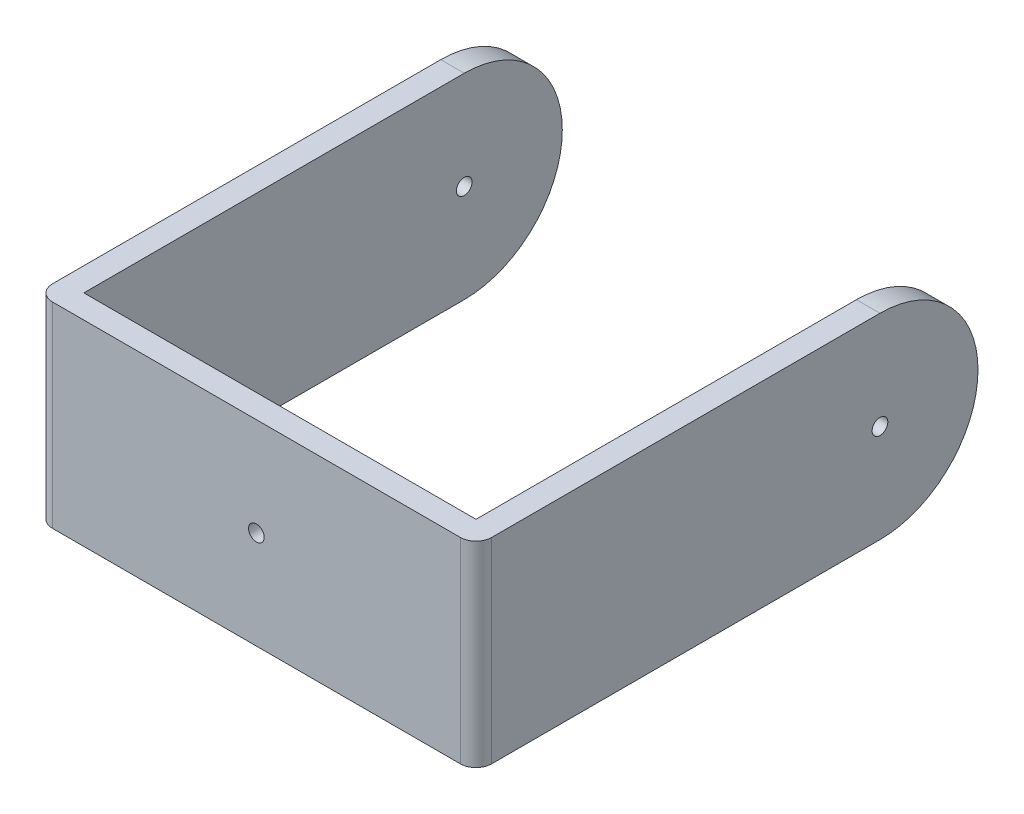
ISO-10303-21;
HEADER;
FILE_DESCRIPTION(('STEP AP214'),'2;1');
FILE_NAME('part.step','',(''),(''),'','','');
FILE_SCHEMA(('AUTOMOTIVE_DESIGN { 1 0 10303 214 1 1 1 1 }'));
ENDSEC;
DATA;
#1=APPLICATION_CONTEXT('core data for automotive mechanical design processes');
#2=APPLICATION_PROTOCOL_DEFINITION('international standard','automotive_design',2000,#1);
#3=PRODUCT_CONTEXT('',#1,'mechanical');
#4=PRODUCT('Part','Part','',(#3));
#5=PRODUCT_RELATED_PRODUCT_CATEGORY('part','',(#4));
#6=PRODUCT_DEFINITION_FORMATION('','',#4);
#7=PRODUCT_DEFINITION_CONTEXT('part definition',#1,'design');
#8=PRODUCT_DEFINITION('design','',#6,#7);
#9=PRODUCT_DEFINITION_SHAPE('','',#8);
#10=(LENGTH_UNIT() NAMED_UNIT(*) SI_UNIT(.MILLI.,.METRE.));
#11=(NAMED_UNIT(*) PLANE_ANGLE_UNIT() SI_UNIT($,.RADIAN.));
#12=(NAMED_UNIT(*) SI_UNIT($,.STERADIAN.) SOLID_ANGLE_UNIT());
#13=UNCERTAINTY_MEASURE_WITH_UNIT(LENGTH_MEASURE(1.E-05),#10,'distance_accuracy_value','');
#14=(GEOMETRIC_REPRESENTATION_CONTEXT(3) GLOBAL_UNCERTAINTY_ASSIGNED_CONTEXT((#13)) GLOBAL_UNIT_ASSIGNED_CONTEXT((#10,
#11,#12)) REPRESENTATION_CONTEXT('',''));
#15=CARTESIAN_POINT('',(0.,0.,0.));
#16=DIRECTION('',(0.,0.,1.));
#17=DIRECTION('',(1.,0.,0.));
#18=AXIS2_PLACEMENT_3D('',#15,#16,#17);
#19=CARTESIAN_POINT('',(56.,12.5,12.5));
#20=DIRECTION('',(-1.,0.,0.));
#21=DIRECTION('',(0.,0.,1.));
#22=AXIS2_PLACEMENT_3D('',#19,#20,#21);
#23=CYLINDRICAL_SURFACE('',#22,12.5);
#24=DIRECTION('',(-1.,0.,0.));
#25=VECTOR('',#24,1.);
#26=CARTESIAN_POINT('',(2.,25.,12.5));
#27=LINE('',#26,#25);
#28=CARTESIAN_POINT('',(56.,25.,12.5));
#29=VERTEX_POINT('',#28);
#30=CARTESIAN_POINT('',(53.,25.,12.5));
#31=VERTEX_POINT('',#30);
#32=EDGE_CURVE('E225',#29,#31,#27,.T.);
#33=ORIENTED_EDGE('',*,*,#32,.F.);
#34=CARTESIAN_POINT('',(56.,12.5,12.5));
#35=DIRECTION('',(-1.,0.,0.));
#36=DIRECTION('',(0.,0.,1.));
#37=AXIS2_PLACEMENT_3D('',#34,#35,#36);
#38=CIRCLE('',#37,12.5);
#39=CARTESIAN_POINT('',(56.,0.,12.5));
#40=VERTEX_POINT('',#39);
#41=EDGE_CURVE('E55',#40,#29,#38,.F.);
#42=ORIENTED_EDGE('',*,*,#41,.F.);
#43=DIRECTION('',(1.,0.,0.));
#44=VECTOR('',#43,1.);
#45=CARTESIAN_POINT('',(56.,0.,12.5));
#46=LINE('',#45,#44);
#47=CARTESIAN_POINT('',(53.,0.,12.5));
#48=VERTEX_POINT('',#47);
#49=EDGE_CURVE('E229',#48,#40,#46,.T.);
#50=ORIENTED_EDGE('',*,*,#49,.F.);
#51=CARTESIAN_POINT('',(53.,12.5,12.5));
#52=DIRECTION('',(1.,0.,0.));
#53=DIRECTION('',(0.,0.,-1.));
#54=AXIS2_PLACEMENT_3D('',#51,#52,#53);
#55=CIRCLE('',#54,12.5);
#56=EDGE_CURVE('E11',#31,#48,#55,.F.);
#57=ORIENTED_EDGE('',*,*,#56,.F.);
#58=EDGE_LOOP('',(#33,#42,#50,#57));
#59=FACE_BOUND('',#58,.T.);
#60=ADVANCED_FACE('F45',(#59),#23,.T.);
#61=CARTESIAN_POINT('',(3.,12.5,12.5));
#62=DIRECTION('',(-1.,0.,0.));
#63=DIRECTION('',(0.,0.,1.));
#64=AXIS2_PLACEMENT_3D('',#61,#62,#63);
#65=CYLINDRICAL_SURFACE('',#64,12.5);
#66=DIRECTION('',(-1.,0.,0.));
#67=VECTOR('',#66,1.);
#68=CARTESIAN_POINT('',(2.,25.,12.5));
#69=LINE('',#68,#67);
#70=CARTESIAN_POINT('',(3.,25.,12.5));
#71=VERTEX_POINT('',#70);
#72=CARTESIAN_POINT('',(0.,25.,12.5));
#73=VERTEX_POINT('',#72);
#74=EDGE_CURVE('E130',#71,#73,#69,.T.);
#75=ORIENTED_EDGE('',*,*,#74,.F.);
#76=CARTESIAN_POINT('',(3.,12.5,12.5));
#77=DIRECTION('',(-1.,0.,0.));
#78=DIRECTION('',(0.,0.,1.));
#79=AXIS2_PLACEMENT_3D('',#76,#77,#78);
#80=CIRCLE('',#79,12.5);
#81=CARTESIAN_POINT('',(3.,0.,12.5));
#82=VERTEX_POINT('',#81);
#83=EDGE_CURVE('E219',#82,#71,#80,.F.);
#84=ORIENTED_EDGE('',*,*,#83,.F.);
#85=DIRECTION('',(1.,0.,0.));
#86=VECTOR('',#85,1.);
#87=CARTESIAN_POINT('',(3.,0.,12.5));
#88=LINE('',#87,#86);
#89=CARTESIAN_POINT('',(0.,0.,12.5));
#90=VERTEX_POINT('',#89);
#91=EDGE_CURVE('E215',#90,#82,#88,.T.);
#92=ORIENTED_EDGE('',*,*,#91,.F.);
#93=CARTESIAN_POINT('',(0.,12.5,12.5));
#94=DIRECTION('',(1.,0.,0.));
#95=DIRECTION('',(0.,0.,-1.));
#96=AXIS2_PLACEMENT_3D('',#93,#94,#95);
#97=CIRCLE('',#96,12.5);
#98=EDGE_CURVE('E222',#73,#90,#97,.F.);
#99=ORIENTED_EDGE('',*,*,#98,.F.);
#100=EDGE_LOOP('',(#75,#84,#92,#99));
#101=FACE_BOUND('',#100,.T.);
#102=ADVANCED_FACE('F260',(#101),#65,.T.);
#103=CARTESIAN_POINT('',(0.,25.,0.));
#104=DIRECTION('',(1.,0.,0.));
#105=DIRECTION('',(0.,0.,-1.));
#106=AXIS2_PLACEMENT_3D('',#103,#104,#105);
#107=PLANE('',#106);
#108=CARTESIAN_POINT('',(0.,12.5,12.5));
#109=DIRECTION('',(-1.,0.,0.));
#110=DIRECTION('',(0.,0.,1.));
#111=AXIS2_PLACEMENT_3D('',#108,#109,#110);
#112=CIRCLE('',#111,1.);
#113=CARTESIAN_POINT('',(0.,12.5,13.5));
#114=VERTEX_POINT('',#113);
#115=EDGE_CURVE('E291',#114,#114,#112,.T.);
#116=ORIENTED_EDGE('',*,*,#115,.F.);
#117=EDGE_LOOP('',(#116));
#118=FACE_BOUND('',#117,.T.);
#119=DIRECTION('',(0.,0.,1.));
#120=VECTOR('',#119,1.);
#121=CARTESIAN_POINT('',(0.,25.,0.));
#122=LINE('',#121,#120);
#123=CARTESIAN_POINT('',(0.,25.,62.));
#124=VERTEX_POINT('',#123);
#125=EDGE_CURVE('E121',#73,#124,#122,.T.);
#126=ORIENTED_EDGE('',*,*,#125,.F.);
#127=ORIENTED_EDGE('',*,*,#98,.T.);
#128=DIRECTION('',(0.,0.,1.));
#129=VECTOR('',#128,1.);
#130=CARTESIAN_POINT('',(0.,0.,0.));
#131=LINE('',#130,#129);
#132=CARTESIAN_POINT('',(0.,0.,62.));
#133=VERTEX_POINT('',#132);
#134=EDGE_CURVE('E139',#90,#133,#131,.T.);
#135=ORIENTED_EDGE('',*,*,#134,.T.);
#136=DIRECTION('',(0.,-1.,0.));
#137=VECTOR('',#136,1.);
#138=CARTESIAN_POINT('',(0.,25.,62.));
#139=LINE('',#138,#137);
#140=EDGE_CURVE('E136',#124,#133,#139,.T.);
#141=ORIENTED_EDGE('',*,*,#140,.F.);
#142=EDGE_LOOP('',(#126,#127,#135,#141));
#143=FACE_BOUND('',#142,.T.);
#144=ADVANCED_FACE('F137',(#118,#143),#107,.F.);
#145=CARTESIAN_POINT('',(2.,25.,62.));
#146=DIRECTION('',(0.,-1.,0.));
#147=DIRECTION('',(0.,0.,-1.));
#148=AXIS2_PLACEMENT_3D('',#145,#146,#147);
#149=CYLINDRICAL_SURFACE('',#148,2.);
#150=CARTESIAN_POINT('',(2.,0.,62.));
#151=DIRECTION('',(0.,1.,0.));
#152=DIRECTION('',(0.,0.,-1.));
#153=AXIS2_PLACEMENT_3D('',#150,#151,#152);
#154=CIRCLE('',#153,2.);
#155=CARTESIAN_POINT('',(2.00000000000001,0.,64.));
#156=VERTEX_POINT('',#155);
#157=EDGE_CURVE('E173',#133,#156,#154,.T.);
#158=ORIENTED_EDGE('',*,*,#157,.T.);
#159=DIRECTION('',(0.,-1.,0.));
#160=VECTOR('',#159,1.);
#161=CARTESIAN_POINT('',(2.00000000000001,25.,64.));
#162=LINE('',#161,#160);
#163=CARTESIAN_POINT('',(2.00000000000001,25.,64.));
#164=VERTEX_POINT('',#163);
#165=EDGE_CURVE('E143',#164,#156,#162,.T.);
#166=ORIENTED_EDGE('',*,*,#165,.F.);
#167=CARTESIAN_POINT('',(2.,25.,62.));
#168=DIRECTION('',(0.,1.,0.));
#169=DIRECTION('',(0.,0.,-1.));
#170=AXIS2_PLACEMENT_3D('',#167,#168,#169);
#171=CIRCLE('',#170,2.);
#172=EDGE_CURVE('E126',#124,#164,#171,.T.);
#173=ORIENTED_EDGE('',*,*,#172,.F.);
#174=ORIENTED_EDGE('',*,*,#140,.T.);
#175=EDGE_LOOP('',(#158,#166,#173,#174));
#176=FACE_BOUND('',#175,.T.);
#177=ADVANCED_FACE('F145',(#176),#149,.T.);
#178=CARTESIAN_POINT('',(2.00000000000001,25.,64.));
#179=DIRECTION('',(0.,0.,-1.));
#180=DIRECTION('',(-1.,0.,0.));
#181=AXIS2_PLACEMENT_3D('',#178,#179,#180);
#182=PLANE('',#181);
#183=CARTESIAN_POINT('',(28.,12.5,64.));
#184=DIRECTION('',(0.,0.,1.));
#185=DIRECTION('',(1.,0.,0.));
#186=AXIS2_PLACEMENT_3D('',#183,#184,#185);
#187=CIRCLE('',#186,1.);
#188=CARTESIAN_POINT('',(29.,12.5,64.));
#189=VERTEX_POINT('',#188);
#190=EDGE_CURVE('E302',#189,#189,#187,.T.);
#191=ORIENTED_EDGE('',*,*,#190,.F.);
#192=EDGE_LOOP('',(#191));
#193=FACE_BOUND('',#192,.T.);
#194=DIRECTION('',(1.,0.,0.));
#195=VECTOR('',#194,1.);
#196=CARTESIAN_POINT('',(2.00000000000001,0.,64.));
#197=LINE('',#196,#195);
#198=CARTESIAN_POINT('',(54.,0.,64.));
#199=VERTEX_POINT('',#198);
#200=EDGE_CURVE('E177',#156,#199,#197,.T.);
#201=ORIENTED_EDGE('',*,*,#200,.T.);
#202=DIRECTION('',(0.,-1.,0.));
#203=VECTOR('',#202,1.);
#204=CARTESIAN_POINT('',(54.,25.,64.));
#205=LINE('',#204,#203);
#206=CARTESIAN_POINT('',(54.,25.,64.));
#207=VERTEX_POINT('',#206);
#208=EDGE_CURVE('E207',#207,#199,#205,.T.);
#209=ORIENTED_EDGE('',*,*,#208,.F.);
#210=DIRECTION('',(1.,0.,0.));
#211=VECTOR('',#210,1.);
#212=CARTESIAN_POINT('',(2.00000000000001,25.,64.));
#213=LINE('',#212,#211);
#214=EDGE_CURVE('E149',#164,#207,#213,.T.);
#215=ORIENTED_EDGE('',*,*,#214,.F.);
#216=ORIENTED_EDGE('',*,*,#165,.T.);
#217=EDGE_LOOP('',(#201,#209,#215,#216));
#218=FACE_BOUND('',#217,.T.);
#219=ADVANCED_FACE('F262',(#193,#218),#182,.F.);
#220=CARTESIAN_POINT('',(54.,25.,62.));
#221=DIRECTION('',(0.,-1.,0.));
#222=DIRECTION('',(0.,0.,-1.));
#223=AXIS2_PLACEMENT_3D('',#220,#221,#222);
#224=CYLINDRICAL_SURFACE('',#223,2.);
#225=CARTESIAN_POINT('',(54.,0.,62.));
#226=DIRECTION('',(0.,1.,0.));
#227=DIRECTION('',(0.,0.,1.));
#228=AXIS2_PLACEMENT_3D('',#225,#226,#227);
#229=CIRCLE('',#228,2.);
#230=CARTESIAN_POINT('',(56.,0.,62.));
#231=VERTEX_POINT('',#230);
#232=EDGE_CURVE('E180',#199,#231,#229,.T.);
#233=ORIENTED_EDGE('',*,*,#232,.T.);
#234=DIRECTION('',(0.,-1.,0.));
#235=VECTOR('',#234,1.);
#236=CARTESIAN_POINT('',(56.,25.,62.));
#237=LINE('',#236,#235);
#238=CARTESIAN_POINT('',(56.,25.,62.));
#239=VERTEX_POINT('',#238);
#240=EDGE_CURVE('E203',#239,#231,#237,.T.);
#241=ORIENTED_EDGE('',*,*,#240,.F.);
#242=CARTESIAN_POINT('',(54.,25.,62.));
#243=DIRECTION('',(0.,1.,0.));
#244=DIRECTION('',(0.,0.,1.));
#245=AXIS2_PLACEMENT_3D('',#242,#243,#244);
#246=CIRCLE('',#245,2.);
#247=EDGE_CURVE('E152',#207,#239,#246,.T.);
#248=ORIENTED_EDGE('',*,*,#247,.F.);
#249=ORIENTED_EDGE('',*,*,#208,.T.);
#250=EDGE_LOOP('',(#233,#241,#248,#249));
#251=FACE_BOUND('',#250,.T.);
#252=ADVANCED_FACE('F241',(#251),#224,.T.);
#253=CARTESIAN_POINT('',(56.,25.,62.));
#254=DIRECTION('',(-1.,0.,0.));
#255=DIRECTION('',(0.,0.,1.));
#256=AXIS2_PLACEMENT_3D('',#253,#254,#255);
#257=PLANE('',#256);
#258=CARTESIAN_POINT('',(56.,12.5,12.5));
#259=DIRECTION('',(-1.,0.,0.));
#260=DIRECTION('',(0.,0.,1.));
#261=AXIS2_PLACEMENT_3D('',#258,#259,#260);
#262=CIRCLE('',#261,1.);
#263=CARTESIAN_POINT('',(56.,12.5,13.5));
#264=VERTEX_POINT('',#263);
#265=EDGE_CURVE('E294',#264,#264,#262,.T.);
#266=ORIENTED_EDGE('',*,*,#265,.T.);
#267=EDGE_LOOP('',(#266));
#268=FACE_BOUND('',#267,.T.);
#269=DIRECTION('',(0.,0.,-1.));
#270=VECTOR('',#269,1.);
#271=CARTESIAN_POINT('',(56.,0.,62.));
#272=LINE('',#271,#270);
#273=EDGE_CURVE('E183',#231,#40,#272,.T.);
#274=ORIENTED_EDGE('',*,*,#273,.T.);
#275=ORIENTED_EDGE('',*,*,#41,.T.);
#276=DIRECTION('',(0.,0.,-1.));
#277=VECTOR('',#276,1.);
#278=CARTESIAN_POINT('',(56.,25.,62.));
#279=LINE('',#278,#277);
#280=EDGE_CURVE('E158',#239,#29,#279,.T.);
#281=ORIENTED_EDGE('',*,*,#280,.F.);
#282=ORIENTED_EDGE('',*,*,#240,.T.);
#283=EDGE_LOOP('',(#274,#275,#281,#282));
#284=FACE_BOUND('',#283,.T.);
#285=ADVANCED_FACE('F235',(#268,#284),#257,.F.);
#286=CARTESIAN_POINT('',(53.,25.,0.));
#287=DIRECTION('',(1.,0.,0.));
#288=DIRECTION('',(0.,0.,-1.));
#289=AXIS2_PLACEMENT_3D('',#286,#287,#288);
#290=PLANE('',#289);
#291=CARTESIAN_POINT('',(53.,12.5,12.5));
#292=DIRECTION('',(1.,0.,0.));
#293=DIRECTION('',(0.,0.,-1.));
#294=AXIS2_PLACEMENT_3D('',#291,#292,#293);
#295=CIRCLE('',#294,1.);
#296=CARTESIAN_POINT('',(53.,12.5,11.5));
#297=VERTEX_POINT('',#296);
#298=EDGE_CURVE('E174',#297,#297,#295,.T.);
#299=ORIENTED_EDGE('',*,*,#298,.T.);
#300=EDGE_LOOP('',(#299));
#301=FACE_BOUND('',#300,.T.);
#302=DIRECTION('',(0.,0.,1.));
#303=VECTOR('',#302,1.);
#304=CARTESIAN_POINT('',(53.,25.,0.));
#305=LINE('',#304,#303);
#306=CARTESIAN_POINT('',(53.,25.,61.));
#307=VERTEX_POINT('',#306);
#308=EDGE_CURVE('E161',#31,#307,#305,.T.);
#309=ORIENTED_EDGE('',*,*,#308,.F.);
#310=ORIENTED_EDGE('',*,*,#56,.T.);
#311=DIRECTION('',(0.,0.,1.));
#312=VECTOR('',#311,1.);
#313=CARTESIAN_POINT('',(53.,0.,0.));
#314=LINE('',#313,#312);
#315=CARTESIAN_POINT('',(53.,0.,61.));
#316=VERTEX_POINT('',#315);
#317=EDGE_CURVE('E187',#48,#316,#314,.T.);
#318=ORIENTED_EDGE('',*,*,#317,.T.);
#319=DIRECTION('',(0.,-1.,0.));
#320=VECTOR('',#319,1.);
#321=CARTESIAN_POINT('',(53.,25.,61.));
#322=LINE('',#321,#320);
#323=EDGE_CURVE('E199',#307,#316,#322,.T.);
#324=ORIENTED_EDGE('',*,*,#323,.F.);
#325=EDGE_LOOP('',(#309,#310,#318,#324));
#326=FACE_BOUND('',#325,.T.);
#327=ADVANCED_FACE('F250',(#301,#326),#290,.F.);
#328=CARTESIAN_POINT('',(53.,25.,61.));
#329=DIRECTION('',(0.,0.,1.));
#330=DIRECTION('',(1.,0.,0.));
#331=AXIS2_PLACEMENT_3D('',#328,#329,#330);
#332=PLANE('',#331);
#333=CARTESIAN_POINT('',(28.,12.5,61.));
#334=DIRECTION('',(0.,0.,1.));
#335=DIRECTION('',(1.,0.,0.));
#336=AXIS2_PLACEMENT_3D('',#333,#334,#335);
#337=CIRCLE('',#336,1.);
#338=CARTESIAN_POINT('',(29.,12.5,61.));
#339=VERTEX_POINT('',#338);
#340=EDGE_CURVE('E295',#339,#339,#337,.F.);
#341=ORIENTED_EDGE('',*,*,#340,.F.);
#342=EDGE_LOOP('',(#341));
#343=FACE_BOUND('',#342,.T.);
#344=DIRECTION('',(-1.,0.,0.));
#345=VECTOR('',#344,1.);
#346=CARTESIAN_POINT('',(53.,0.,61.));
#347=LINE('',#346,#345);
#348=CARTESIAN_POINT('',(3.,0.,61.));
#349=VERTEX_POINT('',#348);
#350=EDGE_CURVE('E190',#316,#349,#347,.T.);
#351=ORIENTED_EDGE('',*,*,#350,.T.);
#352=DIRECTION('',(0.,-1.,0.));
#353=VECTOR('',#352,1.);
#354=CARTESIAN_POINT('',(3.,25.,61.));
#355=LINE('',#354,#353);
#356=CARTESIAN_POINT('',(3.,25.,61.));
#357=VERTEX_POINT('',#356);
#358=EDGE_CURVE('E170',#357,#349,#355,.T.);
#359=ORIENTED_EDGE('',*,*,#358,.F.);
#360=DIRECTION('',(-1.,0.,0.));
#361=VECTOR('',#360,1.);
#362=CARTESIAN_POINT('',(53.,25.,61.));
#363=LINE('',#362,#361);
#364=EDGE_CURVE('E164',#307,#357,#363,.T.);
#365=ORIENTED_EDGE('',*,*,#364,.F.);
#366=ORIENTED_EDGE('',*,*,#323,.T.);
#367=EDGE_LOOP('',(#351,#359,#365,#366));
#368=FACE_BOUND('',#367,.T.);
#369=ADVANCED_FACE('F253',(#343,#368),#332,.F.);
#370=CARTESIAN_POINT('',(3.,25.,61.));
#371=DIRECTION('',(-1.,0.,0.));
#372=DIRECTION('',(0.,0.,1.));
#373=AXIS2_PLACEMENT_3D('',#370,#371,#372);
#374=PLANE('',#373);
#375=CARTESIAN_POINT('',(3.,12.5,12.5));
#376=DIRECTION('',(-1.,0.,0.));
#377=DIRECTION('',(0.,0.,1.));
#378=AXIS2_PLACEMENT_3D('',#375,#376,#377);
#379=CIRCLE('',#378,1.);
#380=CARTESIAN_POINT('',(3.,12.5,13.5));
#381=VERTEX_POINT('',#380);
#382=EDGE_CURVE('E49',#381,#381,#379,.T.);
#383=ORIENTED_EDGE('',*,*,#382,.T.);
#384=EDGE_LOOP('',(#383));
#385=FACE_BOUND('',#384,.T.);
#386=DIRECTION('',(0.,0.,-1.));
#387=VECTOR('',#386,1.);
#388=CARTESIAN_POINT('',(3.,0.,61.));
#389=LINE('',#388,#387);
#390=EDGE_CURVE('E133',#349,#82,#389,.T.);
#391=ORIENTED_EDGE('',*,*,#390,.T.);
#392=ORIENTED_EDGE('',*,*,#83,.T.);
#393=DIRECTION('',(0.,0.,-1.));
#394=VECTOR('',#393,1.);
#395=CARTESIAN_POINT('',(3.,25.,61.));
#396=LINE('',#395,#394);
#397=EDGE_CURVE('E167',#357,#71,#396,.T.);
#398=ORIENTED_EDGE('',*,*,#397,.F.);
#399=ORIENTED_EDGE('',*,*,#358,.T.);
#400=EDGE_LOOP('',(#391,#392,#398,#399));
#401=FACE_BOUND('',#400,.T.);
#402=ADVANCED_FACE('F257',(#385,#401),#374,.F.);
#403=CARTESIAN_POINT('',(2.,25.,62.));
#404=DIRECTION('',(0.,-1.,0.));
#405=DIRECTION('',(0.,0.,-1.));
#406=AXIS2_PLACEMENT_3D('',#403,#404,#405);
#407=PLANE('',#406);
#408=ORIENTED_EDGE('',*,*,#280,.T.);
#409=ORIENTED_EDGE('',*,*,#32,.T.);
#410=ORIENTED_EDGE('',*,*,#308,.T.);
#411=ORIENTED_EDGE('',*,*,#364,.T.);
#412=ORIENTED_EDGE('',*,*,#397,.T.);
#413=ORIENTED_EDGE('',*,*,#74,.T.);
#414=ORIENTED_EDGE('',*,*,#125,.T.);
#415=ORIENTED_EDGE('',*,*,#172,.T.);
#416=ORIENTED_EDGE('',*,*,#214,.T.);
#417=ORIENTED_EDGE('',*,*,#247,.T.);
#418=EDGE_LOOP('',(#408,#409,#410,#411,#412,#413,#414,#415,#416,#417));
#419=FACE_BOUND('',#418,.T.);
#420=ADVANCED_FACE('F124',(#419),#407,.F.);
#421=CARTESIAN_POINT('',(2.,0.,62.));
#422=DIRECTION('',(0.,-1.,0.));
#423=DIRECTION('',(0.,0.,-1.));
#424=AXIS2_PLACEMENT_3D('',#421,#422,#423);
#425=PLANE('',#424);
#426=ORIENTED_EDGE('',*,*,#317,.F.);
#427=ORIENTED_EDGE('',*,*,#49,.T.);
#428=ORIENTED_EDGE('',*,*,#273,.F.);
#429=ORIENTED_EDGE('',*,*,#232,.F.);
#430=ORIENTED_EDGE('',*,*,#200,.F.);
#431=ORIENTED_EDGE('',*,*,#157,.F.);
#432=ORIENTED_EDGE('',*,*,#134,.F.);
#433=ORIENTED_EDGE('',*,*,#91,.T.);
#434=ORIENTED_EDGE('',*,*,#390,.F.);
#435=ORIENTED_EDGE('',*,*,#350,.F.);
#436=EDGE_LOOP('',(#426,#427,#428,#429,#430,#431,#432,#433,#434,#435));
#437=FACE_BOUND('',#436,.T.);
#438=ADVANCED_FACE('F245',(#437),#425,.T.);
#439=CARTESIAN_POINT('',(56.,12.5,12.5));
#440=DIRECTION('',(-1.,0.,0.));
#441=DIRECTION('',(0.,0.,1.));
#442=AXIS2_PLACEMENT_3D('',#439,#440,#441);
#443=CYLINDRICAL_SURFACE('',#442,1.);
#444=ORIENTED_EDGE('',*,*,#115,.T.);
#445=EDGE_LOOP('',(#444));
#446=FACE_BOUND('',#445,.T.);
#447=ORIENTED_EDGE('',*,*,#382,.F.);
#448=EDGE_LOOP('',(#447));
#449=FACE_BOUND('',#448,.T.);
#450=ADVANCED_FACE('F313',(#446,#449),#443,.F.);
#451=ORIENTED_EDGE('',*,*,#265,.F.);
#452=EDGE_LOOP('',(#451));
#453=FACE_BOUND('',#452,.T.);
#454=ORIENTED_EDGE('',*,*,#298,.F.);
#455=EDGE_LOOP('',(#454));
#456=FACE_BOUND('',#455,.T.);
#457=ADVANCED_FACE('F315',(#453,#456),#443,.F.);
#458=CARTESIAN_POINT('',(28.,12.5,-0.001000000000001));
#459=DIRECTION('',(0.,0.,1.));
#460=DIRECTION('',(1.,0.,0.));
#461=AXIS2_PLACEMENT_3D('',#458,#459,#460);
#462=CYLINDRICAL_SURFACE('',#461,1.);
#463=ORIENTED_EDGE('',*,*,#190,.T.);
#464=EDGE_LOOP('',(#463));
#465=FACE_BOUND('',#464,.T.);
#466=ORIENTED_EDGE('',*,*,#340,.T.);
#467=EDGE_LOOP('',(#466));
#468=FACE_BOUND('',#467,.T.);
#469=ADVANCED_FACE('F321',(#465,#468),#462,.F.);
#470=CLOSED_SHELL('',(#60,#102,#144,#177,#219,#252,#285,#327,#369,#402,#420,#438,#450,#457,#469));
#471=MANIFOLD_SOLID_BREP('B2',#470);
#472=ADVANCED_BREP_SHAPE_REPRESENTATION('',(#18,#471),#14);
#473=SHAPE_DEFINITION_REPRESENTATION(#9,#472);
ENDSEC;
END-ISO-10303-21;
